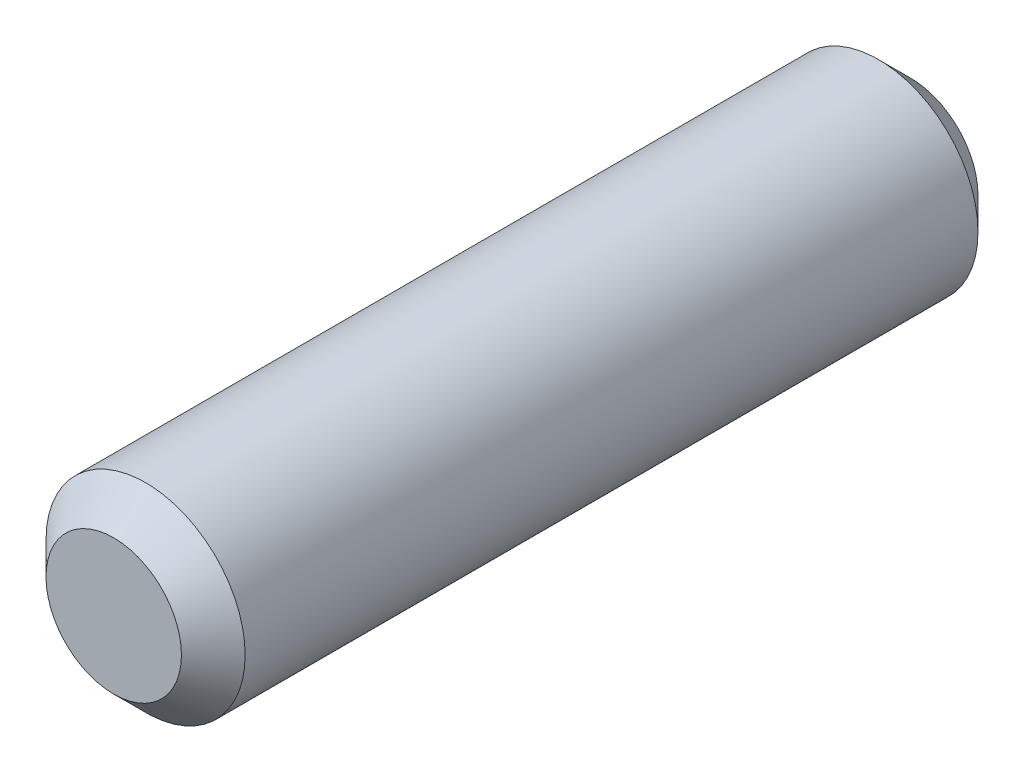
ISO-10303-21;
HEADER;
FILE_DESCRIPTION(('STEP AP214'),'2;1');
FILE_NAME('part.step','',(''),(''),'','','');
FILE_SCHEMA(('AUTOMOTIVE_DESIGN { 1 0 10303 214 1 1 1 1 }'));
ENDSEC;
DATA;
#1=APPLICATION_CONTEXT('core data for automotive mechanical design processes');
#2=APPLICATION_PROTOCOL_DEFINITION('international standard','automotive_design',2000,#1);
#3=PRODUCT_CONTEXT('',#1,'mechanical');
#4=PRODUCT('Part','Part','',(#3));
#5=PRODUCT_RELATED_PRODUCT_CATEGORY('part','',(#4));
#6=PRODUCT_DEFINITION_FORMATION('','',#4);
#7=PRODUCT_DEFINITION_CONTEXT('part definition',#1,'design');
#8=PRODUCT_DEFINITION('design','',#6,#7);
#9=PRODUCT_DEFINITION_SHAPE('','',#8);
#10=(LENGTH_UNIT() NAMED_UNIT(*) SI_UNIT(.MILLI.,.METRE.));
#11=(NAMED_UNIT(*) PLANE_ANGLE_UNIT() SI_UNIT($,.RADIAN.));
#12=(NAMED_UNIT(*) SI_UNIT($,.STERADIAN.) SOLID_ANGLE_UNIT());
#13=UNCERTAINTY_MEASURE_WITH_UNIT(LENGTH_MEASURE(1.E-05),#10,'distance_accuracy_value','');
#14=(GEOMETRIC_REPRESENTATION_CONTEXT(3) GLOBAL_UNCERTAINTY_ASSIGNED_CONTEXT((#13)) GLOBAL_UNIT_ASSIGNED_CONTEXT((#10,
#11,#12)) REPRESENTATION_CONTEXT('',''));
#15=CARTESIAN_POINT('',(0.,0.,0.));
#16=DIRECTION('',(0.,0.,1.));
#17=DIRECTION('',(1.,0.,0.));
#18=AXIS2_PLACEMENT_3D('',#15,#16,#17);
#19=CARTESIAN_POINT('',(0.,0.,4.7625));
#20=DIRECTION('',(0.,0.,-1.));
#21=DIRECTION('',(-1.,0.,0.));
#22=AXIS2_PLACEMENT_3D('',#19,#20,#21);
#23=CYLINDRICAL_SURFACE('',#22,1.190625);
#24=CARTESIAN_POINT('',(0.,0.,-4.3815));
#25=DIRECTION('',(0.,0.,1.));
#26=DIRECTION('',(1.,0.,0.));
#27=AXIS2_PLACEMENT_3D('',#24,#25,#26);
#28=CIRCLE('',#27,1.190625);
#29=CARTESIAN_POINT('',(-1.190625,0.,-4.3815));
#30=VERTEX_POINT('',#29);
#31=EDGE_CURVE('E51',#30,#30,#28,.T.);
#32=CARTESIAN_POINT('',(0.,0.,4.38150000000001));
#33=DIRECTION('',(0.,0.,1.));
#34=DIRECTION('',(1.,0.,0.));
#35=AXIS2_PLACEMENT_3D('',#32,#33,#34);
#36=CIRCLE('',#35,1.190625);
#37=CARTESIAN_POINT('',(-1.190625,0.,4.3815));
#38=VERTEX_POINT('',#37);
#39=EDGE_CURVE('E55',#38,#38,#36,.F.);
#40=CARTESIAN_POINT('',(-1.190625,0.,-4.3815));
#41=CARTESIAN_POINT('',(-1.190625,0.,-4.29021875));
#42=CARTESIAN_POINT('',(-1.190625,0.,-4.1989375));
#43=CARTESIAN_POINT('',(-1.190625,0.,-4.016375));
#44=CARTESIAN_POINT('',(-1.190625,0.,-3.92509375));
#45=CARTESIAN_POINT('',(-1.190625,0.,-3.74253125));
#46=CARTESIAN_POINT('',(-1.190625,0.,-3.65125));
#47=CARTESIAN_POINT('',(-1.190625,0.,-3.4686875));
#48=CARTESIAN_POINT('',(-1.190625,0.,-3.37740625));
#49=CARTESIAN_POINT('',(-1.190625,0.,-3.19484375));
#50=CARTESIAN_POINT('',(-1.190625,0.,-3.1035625));
#51=CARTESIAN_POINT('',(-1.190625,0.,-2.921));
#52=CARTESIAN_POINT('',(-1.190625,0.,-2.82971875));
#53=CARTESIAN_POINT('',(-1.190625,0.,-2.64715625));
#54=CARTESIAN_POINT('',(-1.190625,0.,-2.555875));
#55=CARTESIAN_POINT('',(-1.190625,0.,-2.3733125));
#56=CARTESIAN_POINT('',(-1.190625,0.,-2.28203125));
#57=CARTESIAN_POINT('',(-1.190625,0.,-2.09946875));
#58=CARTESIAN_POINT('',(-1.190625,0.,-2.0081875));
#59=CARTESIAN_POINT('',(-1.190625,0.,-1.825625));
#60=CARTESIAN_POINT('',(-1.190625,0.,-1.73434375));
#61=CARTESIAN_POINT('',(-1.190625,0.,-1.55178125));
#62=CARTESIAN_POINT('',(-1.190625,0.,-1.4605));
#63=CARTESIAN_POINT('',(-1.190625,0.,-1.2779375));
#64=CARTESIAN_POINT('',(-1.190625,0.,-1.18665625));
#65=CARTESIAN_POINT('',(-1.190625,0.,-1.00409375));
#66=CARTESIAN_POINT('',(-1.190625,0.,-0.912812499999997));
#67=CARTESIAN_POINT('',(-1.190625,0.,-0.730249999999997));
#68=CARTESIAN_POINT('',(-1.190625,0.,-0.638968749999997));
#69=CARTESIAN_POINT('',(-1.190625,0.,-0.456406249999997));
#70=CARTESIAN_POINT('',(-1.190625,0.,-0.365124999999997));
#71=CARTESIAN_POINT('',(-1.190625,0.,-0.182562499999996));
#72=CARTESIAN_POINT('',(-1.190625,0.,-0.0912812499999965));
#73=CARTESIAN_POINT('',(-1.190625,0.,0.0912812500000034));
#74=CARTESIAN_POINT('',(-1.190625,0.,0.182562500000003));
#75=CARTESIAN_POINT('',(-1.190625,0.,0.365125000000003));
#76=CARTESIAN_POINT('',(-1.190625,0.,0.456406250000004));
#77=CARTESIAN_POINT('',(-1.190625,0.,0.638968750000004));
#78=CARTESIAN_POINT('',(-1.190625,0.,0.730250000000004));
#79=CARTESIAN_POINT('',(-1.190625,0.,0.912812500000004));
#80=CARTESIAN_POINT('',(-1.190625,0.,1.00409375));
#81=CARTESIAN_POINT('',(-1.190625,0.,1.18665625));
#82=CARTESIAN_POINT('',(-1.190625,0.,1.2779375));
#83=CARTESIAN_POINT('',(-1.190625,0.,1.4605));
#84=CARTESIAN_POINT('',(-1.190625,0.,1.55178125));
#85=CARTESIAN_POINT('',(-1.190625,0.,1.73434375));
#86=CARTESIAN_POINT('',(-1.190625,0.,1.825625));
#87=CARTESIAN_POINT('',(-1.190625,0.,2.0081875));
#88=CARTESIAN_POINT('',(-1.190625,0.,2.09946875));
#89=CARTESIAN_POINT('',(-1.190625,0.,2.28203125));
#90=CARTESIAN_POINT('',(-1.190625,0.,2.3733125));
#91=CARTESIAN_POINT('',(-1.190625,0.,2.555875));
#92=CARTESIAN_POINT('',(-1.190625,0.,2.64715625));
#93=CARTESIAN_POINT('',(-1.190625,0.,2.82971875));
#94=CARTESIAN_POINT('',(-1.190625,0.,2.921));
#95=CARTESIAN_POINT('',(-1.190625,0.,3.1035625));
#96=CARTESIAN_POINT('',(-1.190625,0.,3.19484375));
#97=CARTESIAN_POINT('',(-1.190625,0.,3.37740625));
#98=CARTESIAN_POINT('',(-1.190625,0.,3.4686875));
#99=CARTESIAN_POINT('',(-1.190625,0.,3.65125));
#100=CARTESIAN_POINT('',(-1.190625,0.,3.74253125));
#101=CARTESIAN_POINT('',(-1.190625,0.,3.92509375));
#102=CARTESIAN_POINT('',(-1.190625,0.,4.016375));
#103=CARTESIAN_POINT('',(-1.190625,0.,4.1989375));
#104=CARTESIAN_POINT('',(-1.190625,0.,4.29021875));
#105=CARTESIAN_POINT('',(-1.190625,0.,4.3815));
#106=B_SPLINE_CURVE_WITH_KNOTS('',3,(#40,#41,#42,#43,#44,#45,#46,#47,#48,#49,#50,#51,#52,#53,
#54,#55,#56,#57,#58,#59,#60,#61,#62,#63,#64,#65,#66,#67,#68,#69,#70,#71,#72,#73,#74,#75,#76,#77,
#78,#79,#80,#81,#82,#83,#84,#85,#86,#87,#88,#89,#90,#91,#92,#93,#94,#95,#96,#97,#98,#99,#100,
#101,#102,#103,#104,#105),.UNSPECIFIED.,.F.,.F.,(4,2,2,2,2,2,2,2,2,2,2,2,2,2,2,2,2,2,2,2,2,2,2,
2,2,2,2,2,2,2,2,2,4),(0.,0.273843750000001,0.5476875,0.82153125,1.095375,1.36921875,1.6430625,
1.91690625,2.19075,2.46459375,2.7384375,3.01228125,3.286125,3.55996875,3.8338125,4.10765625,
4.3815,4.65534375,4.9291875,5.20303125,5.476875,5.75071875,6.0245625,6.29840625,6.57225,
6.84609375,7.1199375,7.39378125,7.667625,7.94146875,8.2153125,8.48915625,8.763),.UNSPECIFIED.);
#107=EDGE_CURVE('BSEAM43',#30,#38,#106,.T.);
#108=ORIENTED_EDGE('',*,*,#31,.T.);
#109=ORIENTED_EDGE('',*,*,#39,.T.);
#110=ORIENTED_EDGE('',*,*,#107,.T.);
#111=ORIENTED_EDGE('',*,*,#107,.F.);
#112=EDGE_LOOP('',(#108,#110,#109,#111));
#113=FACE_BOUND('',#112,.T.);
#114=ADVANCED_FACE('F43',(#113),#23,.T.);
#115=CARTESIAN_POINT('',(0.,0.,4.7625));
#116=DIRECTION('',(0.,0.,1.));
#117=DIRECTION('',(1.,0.,0.));
#118=AXIS2_PLACEMENT_3D('',#115,#116,#117);
#119=PLANE('',#118);
#120=CARTESIAN_POINT('',(0.,0.,4.7625));
#121=DIRECTION('',(0.,0.,1.));
#122=DIRECTION('',(1.,0.,0.));
#123=AXIS2_PLACEMENT_3D('',#120,#121,#122);
#124=CIRCLE('',#123,0.809625000000004);
#125=CARTESIAN_POINT('',(0.809625000000004,0.,4.7625));
#126=VERTEX_POINT('',#125);
#127=EDGE_CURVE('E59',#126,#126,#124,.T.);
#128=ORIENTED_EDGE('',*,*,#127,.T.);
#129=EDGE_LOOP('',(#128));
#130=FACE_BOUND('',#129,.T.);
#131=ADVANCED_FACE('F65',(#130),#119,.T.);
#132=CARTESIAN_POINT('',(0.,0.,-4.7625));
#133=DIRECTION('',(0.,0.,1.));
#134=DIRECTION('',(1.,0.,0.));
#135=AXIS2_PLACEMENT_3D('',#132,#133,#134);
#136=PLANE('',#135);
#137=CARTESIAN_POINT('',(0.,0.,-4.7625));
#138=DIRECTION('',(0.,0.,1.));
#139=DIRECTION('',(1.,0.,0.));
#140=AXIS2_PLACEMENT_3D('',#137,#138,#139);
#141=CIRCLE('',#140,0.809624999999992);
#142=CARTESIAN_POINT('',(0.809624999999992,0.,-4.7625));
#143=VERTEX_POINT('',#142);
#144=EDGE_CURVE('E10',#143,#143,#141,.F.);
#145=ORIENTED_EDGE('',*,*,#144,.T.);
#146=EDGE_LOOP('',(#145));
#147=FACE_BOUND('',#146,.T.);
#148=ADVANCED_FACE('F69',(#147),#136,.F.);
#149=CARTESIAN_POINT('',(0.,0.,4.7625));
#150=DIRECTION('',(0.,0.,-1.));
#151=DIRECTION('',(-1.,0.,0.));
#152=AXIS2_PLACEMENT_3D('',#149,#150,#151);
#153=CONICAL_SURFACE('',#152,0.809625000000004,0.78539816339745);
#154=ORIENTED_EDGE('',*,*,#39,.F.);
#155=EDGE_LOOP('',(#154));
#156=FACE_BOUND('',#155,.T.);
#157=ORIENTED_EDGE('',*,*,#127,.F.);
#158=EDGE_LOOP('',(#157));
#159=FACE_BOUND('',#158,.T.);
#160=ADVANCED_FACE('F67',(#156,#159),#153,.T.);
#161=CARTESIAN_POINT('',(0.,0.,-4.3815));
#162=DIRECTION('',(0.,0.,1.));
#163=DIRECTION('',(1.,0.,0.));
#164=AXIS2_PLACEMENT_3D('',#161,#162,#163);
#165=CONICAL_SURFACE('',#164,1.190625,0.785398163397453);
#166=ORIENTED_EDGE('',*,*,#144,.F.);
#167=EDGE_LOOP('',(#166));
#168=FACE_BOUND('',#167,.T.);
#169=ORIENTED_EDGE('',*,*,#31,.F.);
#170=EDGE_LOOP('',(#169));
#171=FACE_BOUND('',#170,.T.);
#172=ADVANCED_FACE('F46',(#168,#171),#165,.T.);
#173=CLOSED_SHELL('',(#114,#131,#148,#160,#172));
#174=MANIFOLD_SOLID_BREP('B2',#173);
#175=ADVANCED_BREP_SHAPE_REPRESENTATION('',(#18,#174),#14);
#176=SHAPE_DEFINITION_REPRESENTATION(#9,#175);
ENDSEC;
END-ISO-10303-21;
